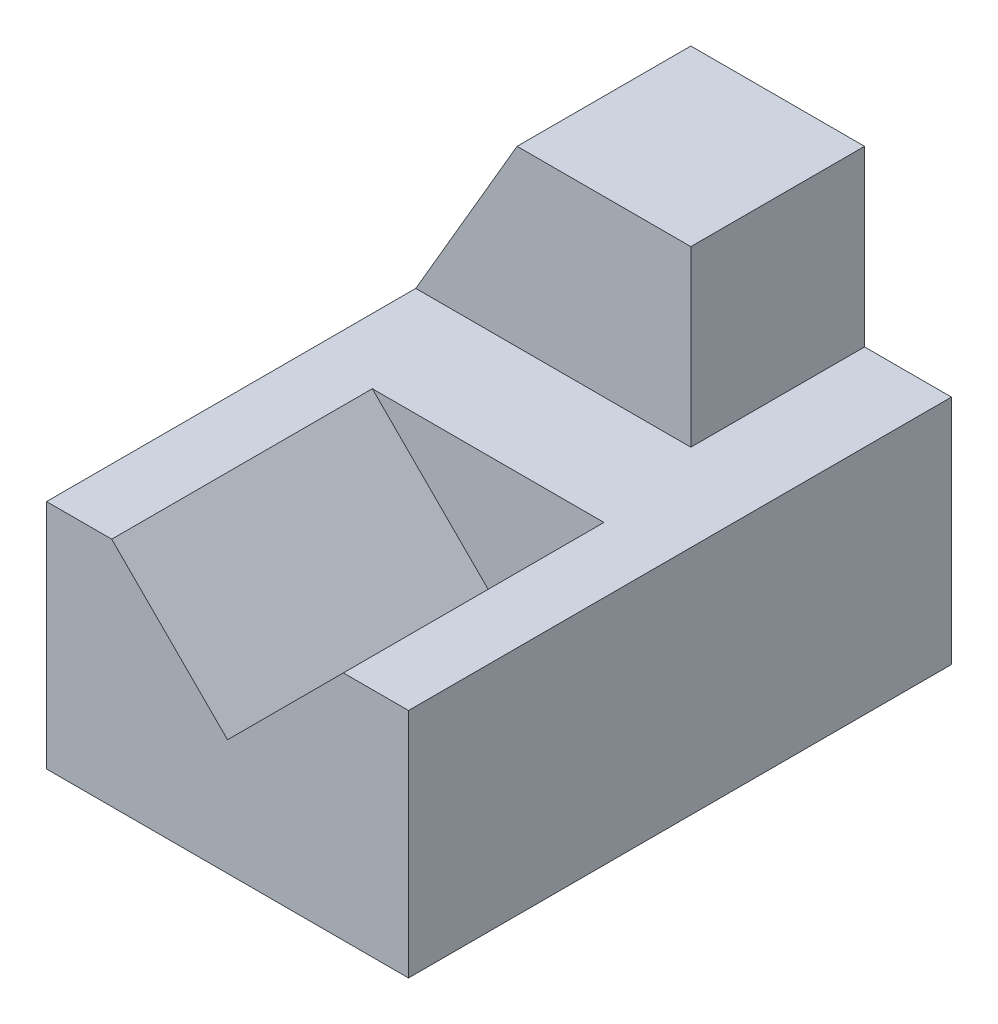
ISO-10303-21;
HEADER;
FILE_DESCRIPTION(('STEP AP214'),'2;1');
FILE_NAME('part.step','',(''),(''),'','','');
FILE_SCHEMA(('AUTOMOTIVE_DESIGN { 1 0 10303 214 1 1 1 1 }'));
ENDSEC;
DATA;
#1=APPLICATION_CONTEXT('core data for automotive mechanical design processes');
#2=APPLICATION_PROTOCOL_DEFINITION('international standard','automotive_design',2000,#1);
#3=PRODUCT_CONTEXT('',#1,'mechanical');
#4=PRODUCT('Part','Part','',(#3));
#5=PRODUCT_RELATED_PRODUCT_CATEGORY('part','',(#4));
#6=PRODUCT_DEFINITION_FORMATION('','',#4);
#7=PRODUCT_DEFINITION_CONTEXT('part definition',#1,'design');
#8=PRODUCT_DEFINITION('design','',#6,#7);
#9=PRODUCT_DEFINITION_SHAPE('','',#8);
#10=(LENGTH_UNIT() NAMED_UNIT(*) SI_UNIT(.MILLI.,.METRE.));
#11=(NAMED_UNIT(*) PLANE_ANGLE_UNIT() SI_UNIT($,.RADIAN.));
#12=(NAMED_UNIT(*) SI_UNIT($,.STERADIAN.) SOLID_ANGLE_UNIT());
#13=UNCERTAINTY_MEASURE_WITH_UNIT(LENGTH_MEASURE(1.E-05),#10,'distance_accuracy_value','');
#14=(GEOMETRIC_REPRESENTATION_CONTEXT(3) GLOBAL_UNCERTAINTY_ASSIGNED_CONTEXT((#13)) GLOBAL_UNIT_ASSIGNED_CONTEXT((#10,
#11,#12)) REPRESENTATION_CONTEXT('',''));
#15=CARTESIAN_POINT('',(0.,0.,0.));
#16=DIRECTION('',(0.,0.,1.));
#17=DIRECTION('',(1.,0.,0.));
#18=AXIS2_PLACEMENT_3D('',#15,#16,#17);
#19=CARTESIAN_POINT('',(0.,4.,75.));
#20=DIRECTION('',(0.,-1.,0.));
#21=DIRECTION('',(1.,0.,0.));
#22=AXIS2_PLACEMENT_3D('',#19,#20,#21);
#23=PLANE('',#22);
#24=DIRECTION('',(0.,0.,-1.));
#25=VECTOR('',#24,1.);
#26=CARTESIAN_POINT('',(13.,4.,24.));
#27=LINE('',#26,#25);
#28=CARTESIAN_POINT('',(13.,4.,24.));
#29=VERTEX_POINT('',#28);
#30=CARTESIAN_POINT('',(13.,4.,0.));
#31=VERTEX_POINT('',#30);
#32=EDGE_CURVE('E191',#29,#31,#27,.T.);
#33=ORIENTED_EDGE('',*,*,#32,.F.);
#34=DIRECTION('',(-1.,0.,0.));
#35=VECTOR('',#34,1.);
#36=CARTESIAN_POINT('',(0.,4.,24.));
#37=LINE('',#36,#35);
#38=CARTESIAN_POINT('',(-25.,4.,24.));
#39=VERTEX_POINT('',#38);
#40=EDGE_CURVE('E176',#29,#39,#37,.T.);
#41=ORIENTED_EDGE('',*,*,#40,.T.);
#42=DIRECTION('',(0.,0.,-1.));
#43=VECTOR('',#42,1.);
#44=CARTESIAN_POINT('',(-25.,4.,75.));
#45=LINE('',#44,#43);
#46=CARTESIAN_POINT('',(-25.,4.,75.));
#47=VERTEX_POINT('',#46);
#48=EDGE_CURVE('E144',#47,#39,#45,.T.);
#49=ORIENTED_EDGE('',*,*,#48,.F.);
#50=DIRECTION('',(-1.,0.,0.));
#51=VECTOR('',#50,1.);
#52=CARTESIAN_POINT('',(0.,4.,75.));
#53=LINE('',#52,#51);
#54=CARTESIAN_POINT('',(-16.,4.,75.));
#55=VERTEX_POINT('',#54);
#56=EDGE_CURVE('E128',#55,#47,#53,.T.);
#57=ORIENTED_EDGE('',*,*,#56,.F.);
#58=DIRECTION('',(0.,0.,-1.));
#59=VECTOR('',#58,1.);
#60=CARTESIAN_POINT('',(-16.,4.,75.));
#61=LINE('',#60,#59);
#62=CARTESIAN_POINT('',(-16.,4.,39.));
#63=VERTEX_POINT('',#62);
#64=EDGE_CURVE('E49',#55,#63,#61,.T.);
#65=ORIENTED_EDGE('',*,*,#64,.T.);
#66=DIRECTION('',(-1.,0.,0.));
#67=VECTOR('',#66,1.);
#68=CARTESIAN_POINT('',(0.,4.,39.));
#69=LINE('',#68,#67);
#70=CARTESIAN_POINT('',(16.,4.,39.));
#71=VERTEX_POINT('',#70);
#72=EDGE_CURVE('E137',#71,#63,#69,.T.);
#73=ORIENTED_EDGE('',*,*,#72,.F.);
#74=DIRECTION('',(0.,0.,-1.));
#75=VECTOR('',#74,1.);
#76=CARTESIAN_POINT('',(16.,4.,75.));
#77=LINE('',#76,#75);
#78=CARTESIAN_POINT('',(16.,4.,75.));
#79=VERTEX_POINT('',#78);
#80=EDGE_CURVE('E126',#79,#71,#77,.T.);
#81=ORIENTED_EDGE('',*,*,#80,.F.);
#82=CARTESIAN_POINT('',(25.,4.,75.));
#83=VERTEX_POINT('',#82);
#84=EDGE_CURVE('E65',#83,#79,#53,.T.);
#85=ORIENTED_EDGE('',*,*,#84,.F.);
#86=DIRECTION('',(0.,0.,-1.));
#87=VECTOR('',#86,1.);
#88=CARTESIAN_POINT('',(25.,4.,75.));
#89=LINE('',#88,#87);
#90=CARTESIAN_POINT('',(25.,4.,0.));
#91=VERTEX_POINT('',#90);
#92=EDGE_CURVE('E83',#83,#91,#89,.T.);
#93=ORIENTED_EDGE('',*,*,#92,.T.);
#94=DIRECTION('',(-1.,0.,0.));
#95=VECTOR('',#94,1.);
#96=CARTESIAN_POINT('',(0.,4.,0.));
#97=LINE('',#96,#95);
#98=EDGE_CURVE('E131',#91,#31,#97,.T.);
#99=ORIENTED_EDGE('',*,*,#98,.T.);
#100=EDGE_LOOP('',(#33,#41,#49,#57,#65,#73,#81,#85,#93,#99));
#101=FACE_BOUND('',#100,.T.);
#102=ADVANCED_FACE('F41',(#101),#23,.F.);
#103=CARTESIAN_POINT('',(6.,-6.,75.));
#104=DIRECTION('',(-0.707106781186548,0.707106781186548,0.));
#105=DIRECTION('',(-0.707106781186548,-0.707106781186548,0.));
#106=AXIS2_PLACEMENT_3D('',#103,#104,#105);
#107=PLANE('',#106);
#108=DIRECTION('',(0.707106781186548,0.707106781186548,0.));
#109=VECTOR('',#108,1.);
#110=CARTESIAN_POINT('',(6.,-6.,39.));
#111=LINE('',#110,#109);
#112=CARTESIAN_POINT('',(0.,-12.,39.));
#113=VERTEX_POINT('',#112);
#114=EDGE_CURVE('E164',#113,#71,#111,.T.);
#115=ORIENTED_EDGE('',*,*,#114,.F.);
#116=DIRECTION('',(0.,0.,-1.));
#117=VECTOR('',#116,1.);
#118=CARTESIAN_POINT('',(0.,-12.,75.));
#119=LINE('',#118,#117);
#120=CARTESIAN_POINT('',(0.,-12.,75.));
#121=VERTEX_POINT('',#120);
#122=EDGE_CURVE('E11',#121,#113,#119,.T.);
#123=ORIENTED_EDGE('',*,*,#122,.F.);
#124=DIRECTION('',(0.707106781186548,0.707106781186548,0.));
#125=VECTOR('',#124,1.);
#126=CARTESIAN_POINT('',(6.,-6.,75.));
#127=LINE('',#126,#125);
#128=EDGE_CURVE('E133',#121,#79,#127,.T.);
#129=ORIENTED_EDGE('',*,*,#128,.T.);
#130=ORIENTED_EDGE('',*,*,#80,.T.);
#131=EDGE_LOOP('',(#115,#123,#129,#130));
#132=FACE_BOUND('',#131,.T.);
#133=ADVANCED_FACE('F43',(#132),#107,.T.);
#134=CARTESIAN_POINT('',(-6.,-6.,75.));
#135=DIRECTION('',(0.707106781186548,0.707106781186548,0.));
#136=DIRECTION('',(-0.707106781186548,0.707106781186548,0.));
#137=AXIS2_PLACEMENT_3D('',#134,#135,#136);
#138=PLANE('',#137);
#139=DIRECTION('',(0.707106781186548,-0.707106781186548,0.));
#140=VECTOR('',#139,1.);
#141=CARTESIAN_POINT('',(-6.,-6.,39.));
#142=LINE('',#141,#140);
#143=EDGE_CURVE('E160',#63,#113,#142,.T.);
#144=ORIENTED_EDGE('',*,*,#143,.F.);
#145=ORIENTED_EDGE('',*,*,#64,.F.);
#146=DIRECTION('',(0.707106781186548,-0.707106781186548,0.));
#147=VECTOR('',#146,1.);
#148=CARTESIAN_POINT('',(-6.,-6.,75.));
#149=LINE('',#148,#147);
#150=EDGE_CURVE('E158',#55,#121,#149,.T.);
#151=ORIENTED_EDGE('',*,*,#150,.T.);
#152=ORIENTED_EDGE('',*,*,#122,.T.);
#153=EDGE_LOOP('',(#144,#145,#151,#152));
#154=FACE_BOUND('',#153,.T.);
#155=ADVANCED_FACE('F157',(#154),#138,.T.);
#156=CARTESIAN_POINT('',(-25.,0.,75.));
#157=DIRECTION('',(1.,0.,0.));
#158=DIRECTION('',(0.,1.,0.));
#159=AXIS2_PLACEMENT_3D('',#156,#157,#158);
#160=PLANE('',#159);
#161=DIRECTION('',(0.,-1.,0.));
#162=VECTOR('',#161,1.);
#163=CARTESIAN_POINT('',(-25.,0.,0.));
#164=LINE('',#163,#162);
#165=CARTESIAN_POINT('',(-25.,4.,0.));
#166=VERTEX_POINT('',#165);
#167=CARTESIAN_POINT('',(-25.,-28.,0.));
#168=VERTEX_POINT('',#167);
#169=EDGE_CURVE('E135',#166,#168,#164,.T.);
#170=ORIENTED_EDGE('',*,*,#169,.T.);
#171=DIRECTION('',(0.,0.,-1.));
#172=VECTOR('',#171,1.);
#173=CARTESIAN_POINT('',(-25.,-28.,75.));
#174=LINE('',#173,#172);
#175=CARTESIAN_POINT('',(-25.,-28.,75.));
#176=VERTEX_POINT('',#175);
#177=EDGE_CURVE('E122',#176,#168,#174,.T.);
#178=ORIENTED_EDGE('',*,*,#177,.F.);
#179=DIRECTION('',(0.,-1.,0.));
#180=VECTOR('',#179,1.);
#181=CARTESIAN_POINT('',(-25.,0.,75.));
#182=LINE('',#181,#180);
#183=EDGE_CURVE('E109',#47,#176,#182,.T.);
#184=ORIENTED_EDGE('',*,*,#183,.F.);
#185=ORIENTED_EDGE('',*,*,#48,.T.);
#186=DIRECTION('',(0.,0.,-1.));
#187=VECTOR('',#186,1.);
#188=CARTESIAN_POINT('',(-25.,4.,24.));
#189=LINE('',#188,#187);
#190=EDGE_CURVE('E56',#39,#166,#189,.T.);
#191=ORIENTED_EDGE('',*,*,#190,.T.);
#192=EDGE_LOOP('',(#170,#178,#184,#185,#191));
#193=FACE_BOUND('',#192,.T.);
#194=ADVANCED_FACE('F178',(#193),#160,.F.);
#195=CARTESIAN_POINT('',(0.,-28.,75.));
#196=DIRECTION('',(0.,1.,0.));
#197=DIRECTION('',(0.,0.,1.));
#198=AXIS2_PLACEMENT_3D('',#195,#196,#197);
#199=PLANE('',#198);
#200=DIRECTION('',(1.,0.,0.));
#201=VECTOR('',#200,1.);
#202=CARTESIAN_POINT('',(0.,-28.,0.));
#203=LINE('',#202,#201);
#204=CARTESIAN_POINT('',(25.,-28.,0.));
#205=VERTEX_POINT('',#204);
#206=EDGE_CURVE('E118',#168,#205,#203,.T.);
#207=ORIENTED_EDGE('',*,*,#206,.T.);
#208=DIRECTION('',(0.,0.,-1.));
#209=VECTOR('',#208,1.);
#210=CARTESIAN_POINT('',(25.,-28.,75.));
#211=LINE('',#210,#209);
#212=CARTESIAN_POINT('',(25.,-28.,75.));
#213=VERTEX_POINT('',#212);
#214=EDGE_CURVE('E115',#213,#205,#211,.T.);
#215=ORIENTED_EDGE('',*,*,#214,.F.);
#216=DIRECTION('',(1.,0.,0.));
#217=VECTOR('',#216,1.);
#218=CARTESIAN_POINT('',(0.,-28.,75.));
#219=LINE('',#218,#217);
#220=EDGE_CURVE('E103',#176,#213,#219,.T.);
#221=ORIENTED_EDGE('',*,*,#220,.F.);
#222=ORIENTED_EDGE('',*,*,#177,.T.);
#223=EDGE_LOOP('',(#207,#215,#221,#222));
#224=FACE_BOUND('',#223,.T.);
#225=ADVANCED_FACE('F116',(#224),#199,.F.);
#226=CARTESIAN_POINT('',(25.,0.,75.));
#227=DIRECTION('',(1.,0.,0.));
#228=DIRECTION('',(0.,1.,0.));
#229=AXIS2_PLACEMENT_3D('',#226,#227,#228);
#230=PLANE('',#229);
#231=DIRECTION('',(0.,-1.,0.));
#232=VECTOR('',#231,1.);
#233=CARTESIAN_POINT('',(25.,0.,0.));
#234=LINE('',#233,#232);
#235=EDGE_CURVE('E134',#91,#205,#234,.T.);
#236=ORIENTED_EDGE('',*,*,#235,.F.);
#237=ORIENTED_EDGE('',*,*,#92,.F.);
#238=DIRECTION('',(0.,-1.,0.));
#239=VECTOR('',#238,1.);
#240=CARTESIAN_POINT('',(25.,0.,75.));
#241=LINE('',#240,#239);
#242=EDGE_CURVE('E107',#83,#213,#241,.T.);
#243=ORIENTED_EDGE('',*,*,#242,.T.);
#244=ORIENTED_EDGE('',*,*,#214,.T.);
#245=EDGE_LOOP('',(#236,#237,#243,#244));
#246=FACE_BOUND('',#245,.T.);
#247=ADVANCED_FACE('F124',(#246),#230,.T.);
#248=CARTESIAN_POINT('',(0.,0.,75.));
#249=DIRECTION('',(0.,0.,1.));
#250=DIRECTION('',(1.,0.,0.));
#251=AXIS2_PLACEMENT_3D('',#248,#249,#250);
#252=PLANE('',#251);
#253=ORIENTED_EDGE('',*,*,#128,.F.);
#254=ORIENTED_EDGE('',*,*,#150,.F.);
#255=ORIENTED_EDGE('',*,*,#56,.T.);
#256=ORIENTED_EDGE('',*,*,#183,.T.);
#257=ORIENTED_EDGE('',*,*,#220,.T.);
#258=ORIENTED_EDGE('',*,*,#242,.F.);
#259=ORIENTED_EDGE('',*,*,#84,.T.);
#260=EDGE_LOOP('',(#253,#254,#255,#256,#257,#258,#259));
#261=FACE_BOUND('',#260,.T.);
#262=ADVANCED_FACE('F105',(#261),#252,.T.);
#263=CARTESIAN_POINT('',(0.,0.,0.));
#264=DIRECTION('',(0.,0.,1.));
#265=DIRECTION('',(1.,0.,0.));
#266=AXIS2_PLACEMENT_3D('',#263,#264,#265);
#267=PLANE('',#266);
#268=ORIENTED_EDGE('',*,*,#169,.F.);
#269=DIRECTION('',(-0.503871025524086,-0.863778900898433,0.));
#270=VECTOR('',#269,1.);
#271=CARTESIAN_POINT('',(-20.3937823834197,11.8963730569948,0.));
#272=LINE('',#271,#270);
#273=CARTESIAN_POINT('',(-11.,28.,0.));
#274=VERTEX_POINT('',#273);
#275=EDGE_CURVE('E362',#274,#166,#272,.T.);
#276=ORIENTED_EDGE('',*,*,#275,.F.);
#277=DIRECTION('',(1.,0.,0.));
#278=VECTOR('',#277,1.);
#279=CARTESIAN_POINT('',(0.,28.,0.));
#280=LINE('',#279,#278);
#281=CARTESIAN_POINT('',(13.,28.,0.));
#282=VERTEX_POINT('',#281);
#283=EDGE_CURVE('E368',#274,#282,#280,.T.);
#284=ORIENTED_EDGE('',*,*,#283,.T.);
#285=DIRECTION('',(0.,1.,0.));
#286=VECTOR('',#285,1.);
#287=CARTESIAN_POINT('',(13.,0.,0.));
#288=LINE('',#287,#286);
#289=EDGE_CURVE('E188',#31,#282,#288,.T.);
#290=ORIENTED_EDGE('',*,*,#289,.F.);
#291=ORIENTED_EDGE('',*,*,#98,.F.);
#292=ORIENTED_EDGE('',*,*,#235,.T.);
#293=ORIENTED_EDGE('',*,*,#206,.F.);
#294=EDGE_LOOP('',(#268,#276,#284,#290,#291,#292,#293));
#295=FACE_BOUND('',#294,.T.);
#296=ADVANCED_FACE('F181',(#295),#267,.F.);
#297=CARTESIAN_POINT('',(0.,0.,39.));
#298=DIRECTION('',(0.,0.,1.));
#299=DIRECTION('',(1.,0.,0.));
#300=AXIS2_PLACEMENT_3D('',#297,#298,#299);
#301=PLANE('',#300);
#302=ORIENTED_EDGE('',*,*,#143,.T.);
#303=ORIENTED_EDGE('',*,*,#114,.T.);
#304=ORIENTED_EDGE('',*,*,#72,.T.);
#305=EDGE_LOOP('',(#302,#303,#304));
#306=FACE_BOUND('',#305,.T.);
#307=ADVANCED_FACE('F204',(#306),#301,.T.);
#308=CARTESIAN_POINT('',(0.,28.,24.));
#309=DIRECTION('',(0.,1.,0.));
#310=DIRECTION('',(0.,0.,1.));
#311=AXIS2_PLACEMENT_3D('',#308,#309,#310);
#312=PLANE('',#311);
#313=ORIENTED_EDGE('',*,*,#283,.F.);
#314=DIRECTION('',(0.,0.,-1.));
#315=VECTOR('',#314,1.);
#316=CARTESIAN_POINT('',(-11.,28.,24.));
#317=LINE('',#316,#315);
#318=CARTESIAN_POINT('',(-11.,28.,24.));
#319=VERTEX_POINT('',#318);
#320=EDGE_CURVE('E165',#319,#274,#317,.T.);
#321=ORIENTED_EDGE('',*,*,#320,.F.);
#322=DIRECTION('',(1.,0.,0.));
#323=VECTOR('',#322,1.);
#324=CARTESIAN_POINT('',(0.,28.,24.));
#325=LINE('',#324,#323);
#326=CARTESIAN_POINT('',(13.,28.,24.));
#327=VERTEX_POINT('',#326);
#328=EDGE_CURVE('E354',#319,#327,#325,.T.);
#329=ORIENTED_EDGE('',*,*,#328,.T.);
#330=DIRECTION('',(0.,0.,-1.));
#331=VECTOR('',#330,1.);
#332=CARTESIAN_POINT('',(13.,28.,24.));
#333=LINE('',#332,#331);
#334=EDGE_CURVE('E367',#327,#282,#333,.T.);
#335=ORIENTED_EDGE('',*,*,#334,.T.);
#336=EDGE_LOOP('',(#313,#321,#329,#335));
#337=FACE_BOUND('',#336,.T.);
#338=ADVANCED_FACE('F250',(#337),#312,.T.);
#339=CARTESIAN_POINT('',(-20.3937823834197,11.8963730569948,24.));
#340=DIRECTION('',(0.863778900898433,-0.503871025524086,0.));
#341=DIRECTION('',(0.503871025524086,0.863778900898433,0.));
#342=AXIS2_PLACEMENT_3D('',#339,#340,#341);
#343=PLANE('',#342);
#344=ORIENTED_EDGE('',*,*,#275,.T.);
#345=ORIENTED_EDGE('',*,*,#190,.F.);
#346=DIRECTION('',(-0.503871025524086,-0.863778900898433,0.));
#347=VECTOR('',#346,1.);
#348=CARTESIAN_POINT('',(-20.3937823834197,11.8963730569948,24.));
#349=LINE('',#348,#347);
#350=EDGE_CURVE('E355',#319,#39,#349,.T.);
#351=ORIENTED_EDGE('',*,*,#350,.F.);
#352=ORIENTED_EDGE('',*,*,#320,.T.);
#353=EDGE_LOOP('',(#344,#345,#351,#352));
#354=FACE_BOUND('',#353,.T.);
#355=ADVANCED_FACE('F256',(#354),#343,.F.);
#356=CARTESIAN_POINT('',(13.,0.,24.));
#357=DIRECTION('',(-1.,0.,0.));
#358=DIRECTION('',(0.,0.,1.));
#359=AXIS2_PLACEMENT_3D('',#356,#357,#358);
#360=PLANE('',#359);
#361=ORIENTED_EDGE('',*,*,#289,.T.);
#362=ORIENTED_EDGE('',*,*,#334,.F.);
#363=DIRECTION('',(0.,1.,0.));
#364=VECTOR('',#363,1.);
#365=CARTESIAN_POINT('',(13.,0.,24.));
#366=LINE('',#365,#364);
#367=EDGE_CURVE('E356',#29,#327,#366,.T.);
#368=ORIENTED_EDGE('',*,*,#367,.F.);
#369=ORIENTED_EDGE('',*,*,#32,.T.);
#370=EDGE_LOOP('',(#361,#362,#368,#369));
#371=FACE_BOUND('',#370,.T.);
#372=ADVANCED_FACE('F264',(#371),#360,.F.);
#373=CARTESIAN_POINT('',(0.,0.,24.));
#374=DIRECTION('',(0.,0.,1.));
#375=DIRECTION('',(1.,0.,0.));
#376=AXIS2_PLACEMENT_3D('',#373,#374,#375);
#377=PLANE('',#376);
#378=ORIENTED_EDGE('',*,*,#328,.F.);
#379=ORIENTED_EDGE('',*,*,#350,.T.);
#380=ORIENTED_EDGE('',*,*,#40,.F.);
#381=ORIENTED_EDGE('',*,*,#367,.T.);
#382=EDGE_LOOP('',(#378,#379,#380,#381));
#383=FACE_BOUND('',#382,.T.);
#384=ADVANCED_FACE('F271',(#383),#377,.T.);
#385=CLOSED_SHELL('',(#102,#133,#155,#194,#225,#247,#262,#296,#307,#338,#355,#372,#384));
#386=MANIFOLD_SOLID_BREP('B2',#385);
#387=ADVANCED_BREP_SHAPE_REPRESENTATION('',(#18,#386),#14);
#388=SHAPE_DEFINITION_REPRESENTATION(#9,#387);
ENDSEC;
END-ISO-10303-21;
